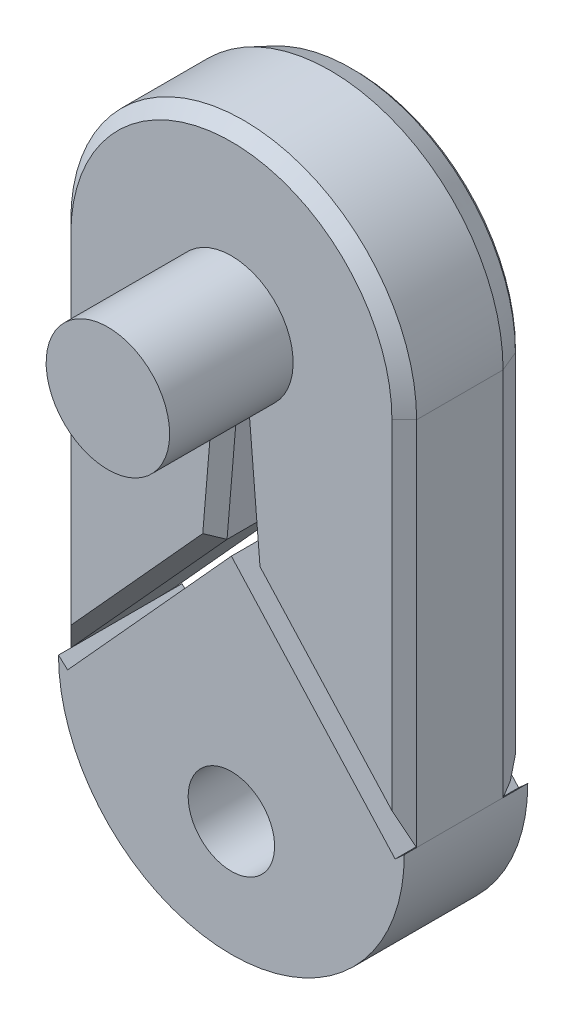
ISO-10303-21;
HEADER;
FILE_DESCRIPTION(('STEP AP214'),'2;1');
FILE_NAME('part.step','',(''),(''),'','','');
FILE_SCHEMA(('AUTOMOTIVE_DESIGN { 1 0 10303 214 1 1 1 1 }'));
ENDSEC;
DATA;
#1=APPLICATION_CONTEXT('core data for automotive mechanical design processes');
#2=APPLICATION_PROTOCOL_DEFINITION('international standard','automotive_design',2000,#1);
#3=PRODUCT_CONTEXT('',#1,'mechanical');
#4=PRODUCT('Part','Part','',(#3));
#5=PRODUCT_RELATED_PRODUCT_CATEGORY('part','',(#4));
#6=PRODUCT_DEFINITION_FORMATION('','',#4);
#7=PRODUCT_DEFINITION_CONTEXT('part definition',#1,'design');
#8=PRODUCT_DEFINITION('design','',#6,#7);
#9=PRODUCT_DEFINITION_SHAPE('','',#8);
#10=(LENGTH_UNIT() NAMED_UNIT(*) SI_UNIT(.MILLI.,.METRE.));
#11=(NAMED_UNIT(*) PLANE_ANGLE_UNIT() SI_UNIT($,.RADIAN.));
#12=(NAMED_UNIT(*) SI_UNIT($,.STERADIAN.) SOLID_ANGLE_UNIT());
#13=UNCERTAINTY_MEASURE_WITH_UNIT(LENGTH_MEASURE(1.E-05),#10,'distance_accuracy_value','');
#14=(GEOMETRIC_REPRESENTATION_CONTEXT(3) GLOBAL_UNCERTAINTY_ASSIGNED_CONTEXT((#13)) GLOBAL_UNIT_ASSIGNED_CONTEXT((#10,
#11,#12)) REPRESENTATION_CONTEXT('',''));
#15=CARTESIAN_POINT('',(0.,0.,0.));
#16=DIRECTION('',(0.,0.,1.));
#17=DIRECTION('',(1.,0.,0.));
#18=AXIS2_PLACEMENT_3D('',#15,#16,#17);
#19=CARTESIAN_POINT('',(0.,0.,10.));
#20=DIRECTION('',(0.,0.,1.));
#21=DIRECTION('',(1.,0.,0.));
#22=AXIS2_PLACEMENT_3D('',#19,#20,#21);
#23=PLANE('',#22);
#24=DIRECTION('',(0.,-1.,0.));
#25=VECTOR('',#24,1.);
#26=CARTESIAN_POINT('',(-13.,-30.,10.));
#27=LINE('',#26,#25);
#28=CARTESIAN_POINT('',(-13.,0.,10.));
#29=VERTEX_POINT('',#28);
#30=CARTESIAN_POINT('',(-13.,-27.4101408235993,10.));
#31=VERTEX_POINT('',#30);
#32=EDGE_CURVE('E243',#29,#31,#27,.T.);
#33=ORIENTED_EDGE('',*,*,#32,.T.);
#34=DIRECTION('',(0.672047401482572,0.740508129705895,0.));
#35=VECTOR('',#34,1.);
#36=CARTESIAN_POINT('',(-2.09093219648444,-15.3897783042367,10.));
#37=LINE('',#36,#35);
#38=CARTESIAN_POINT('',(-2.31853417543574,-15.6405658459767,10.));
#39=VERTEX_POINT('',#38);
#40=EDGE_CURVE('E314',#31,#39,#37,.T.);
#41=ORIENTED_EDGE('',*,*,#40,.T.);
#42=DIRECTION('',(0.0837810256564782,0.996484189407915,0.));
#43=VECTOR('',#42,1.);
#44=CARTESIAN_POINT('',(-1.41538931769032,-4.89863992138309,10.));
#45=LINE('',#44,#43);
#46=CARTESIAN_POINT('',(-1.40692571537873,-4.79797457594411,10.));
#47=VERTEX_POINT('',#46);
#48=EDGE_CURVE('E312',#39,#47,#45,.T.);
#49=ORIENTED_EDGE('',*,*,#48,.T.);
#50=CARTESIAN_POINT('',(0.,0.,10.));
#51=DIRECTION('',(0.,0.,1.));
#52=DIRECTION('',(1.,0.,0.));
#53=AXIS2_PLACEMENT_3D('',#50,#51,#52);
#54=CIRCLE('',#53,5.);
#55=CARTESIAN_POINT('',(1.40692571537873,-4.79797457594411,10.));
#56=VERTEX_POINT('',#55);
#57=EDGE_CURVE('E205',#56,#47,#54,.T.);
#58=ORIENTED_EDGE('',*,*,#57,.F.);
#59=DIRECTION('',(0.0837810256564782,-0.996484189407915,0.));
#60=VECTOR('',#59,1.);
#61=CARTESIAN_POINT('',(2.34690825618647,-15.9780446800628,10.));
#62=LINE('',#61,#60);
#63=CARTESIAN_POINT('',(2.31853417543574,-15.6405658459767,10.));
#64=VERTEX_POINT('',#63);
#65=EDGE_CURVE('E308',#56,#64,#62,.T.);
#66=ORIENTED_EDGE('',*,*,#65,.T.);
#67=DIRECTION('',(0.67204740148257,-0.740508129705897,0.));
#68=VECTOR('',#67,1.);
#69=CARTESIAN_POINT('',(13.7405081297059,-28.2260837004721,10.));
#70=LINE('',#69,#68);
#71=CARTESIAN_POINT('',(13.,-27.4101408235993,10.));
#72=VERTEX_POINT('',#71);
#73=EDGE_CURVE('E310',#64,#72,#70,.T.);
#74=ORIENTED_EDGE('',*,*,#73,.T.);
#75=DIRECTION('',(0.,1.,0.));
#76=VECTOR('',#75,1.);
#77=CARTESIAN_POINT('',(13.,0.,10.));
#78=LINE('',#77,#76);
#79=CARTESIAN_POINT('',(13.,0.,10.));
#80=VERTEX_POINT('',#79);
#81=EDGE_CURVE('E235',#72,#80,#78,.T.);
#82=ORIENTED_EDGE('',*,*,#81,.T.);
#83=CARTESIAN_POINT('',(0.,0.,10.));
#84=DIRECTION('',(0.,0.,1.));
#85=DIRECTION('',(1.,0.,0.));
#86=AXIS2_PLACEMENT_3D('',#83,#84,#85);
#87=CIRCLE('',#86,13.);
#88=EDGE_CURVE('E241',#80,#29,#87,.T.);
#89=ORIENTED_EDGE('',*,*,#88,.T.);
#90=EDGE_LOOP('',(#33,#41,#49,#58,#66,#74,#82,#89));
#91=FACE_BOUND('',#90,.T.);
#92=ADVANCED_FACE('F48',(#91),#23,.T.);
#93=CARTESIAN_POINT('',(0.,0.,10.));
#94=DIRECTION('',(0.,0.,-1.));
#95=DIRECTION('',(-1.,0.,0.));
#96=AXIS2_PLACEMENT_3D('',#93,#94,#95);
#97=CYLINDRICAL_SURFACE('',#96,14.);
#98=DIRECTION('',(0.,0.,-1.));
#99=VECTOR('',#98,1.);
#100=CARTESIAN_POINT('',(14.,0.,10.));
#101=LINE('',#100,#99);
#102=CARTESIAN_POINT('',(14.,0.,9.00000000000001));
#103=VERTEX_POINT('',#102);
#104=CARTESIAN_POINT('',(14.,0.,2.00000000000002));
#105=VERTEX_POINT('',#104);
#106=EDGE_CURVE('E220',#103,#105,#101,.T.);
#107=ORIENTED_EDGE('',*,*,#106,.T.);
#108=CARTESIAN_POINT('',(0.,0.,2.00000000000002));
#109=DIRECTION('',(0.,0.,-1.));
#110=DIRECTION('',(-1.,0.,0.));
#111=AXIS2_PLACEMENT_3D('',#108,#109,#110);
#112=CIRCLE('',#111,14.);
#113=CARTESIAN_POINT('',(-14.,0.,2.00000000000002));
#114=VERTEX_POINT('',#113);
#115=EDGE_CURVE('E58',#105,#114,#112,.F.);
#116=ORIENTED_EDGE('',*,*,#115,.T.);
#117=DIRECTION('',(0.,0.,-1.));
#118=VECTOR('',#117,1.);
#119=CARTESIAN_POINT('',(-14.,0.,10.));
#120=LINE('',#119,#118);
#121=CARTESIAN_POINT('',(-14.,0.,9.00000000000001));
#122=VERTEX_POINT('',#121);
#123=EDGE_CURVE('E214',#122,#114,#120,.T.);
#124=ORIENTED_EDGE('',*,*,#123,.F.);
#125=CARTESIAN_POINT('',(0.,0.,9.00000000000001));
#126=DIRECTION('',(0.,0.,1.));
#127=DIRECTION('',(1.,0.,0.));
#128=AXIS2_PLACEMENT_3D('',#125,#126,#127);
#129=CIRCLE('',#128,14.);
#130=EDGE_CURVE('E248',#122,#103,#129,.F.);
#131=ORIENTED_EDGE('',*,*,#130,.T.);
#132=EDGE_LOOP('',(#107,#116,#124,#131));
#133=FACE_BOUND('',#132,.T.);
#134=ADVANCED_FACE('F388',(#133),#97,.T.);
#135=CARTESIAN_POINT('',(-14.,0.,10.));
#136=DIRECTION('',(1.,0.,0.));
#137=DIRECTION('',(0.,1.,0.));
#138=AXIS2_PLACEMENT_3D('',#135,#136,#137);
#139=PLANE('',#138);
#140=ORIENTED_EDGE('',*,*,#123,.T.);
#141=DIRECTION('',(0.,-1.,0.));
#142=VECTOR('',#141,1.);
#143=CARTESIAN_POINT('',(-14.,-30.,2.00000000000002));
#144=LINE('',#143,#142);
#145=CARTESIAN_POINT('',(-14.,-30.,2.00000000000002));
#146=VERTEX_POINT('',#145);
#147=EDGE_CURVE('E341',#114,#146,#144,.T.);
#148=ORIENTED_EDGE('',*,*,#147,.T.);
#149=DIRECTION('',(0.,0.,-1.));
#150=VECTOR('',#149,1.);
#151=CARTESIAN_POINT('',(-14.,-30.,10.));
#152=LINE('',#151,#150);
#153=CARTESIAN_POINT('',(-14.,-30.,9.00000000000001));
#154=VERTEX_POINT('',#153);
#155=EDGE_CURVE('E233',#154,#146,#152,.T.);
#156=ORIENTED_EDGE('',*,*,#155,.F.);
#157=DIRECTION('',(0.,1.,0.));
#158=VECTOR('',#157,1.);
#159=CARTESIAN_POINT('',(-14.,0.,9.00000000000001));
#160=LINE('',#159,#158);
#161=EDGE_CURVE('E246',#154,#122,#160,.T.);
#162=ORIENTED_EDGE('',*,*,#161,.T.);
#163=EDGE_LOOP('',(#140,#148,#156,#162));
#164=FACE_BOUND('',#163,.T.);
#165=ADVANCED_FACE('F363',(#164),#139,.F.);
#166=CARTESIAN_POINT('',(14.,0.,10.));
#167=DIRECTION('',(-1.,0.,0.));
#168=DIRECTION('',(0.,-1.,0.));
#169=AXIS2_PLACEMENT_3D('',#166,#167,#168);
#170=PLANE('',#169);
#171=DIRECTION('',(0.,0.,-1.));
#172=VECTOR('',#171,1.);
#173=CARTESIAN_POINT('',(14.,-30.,10.));
#174=LINE('',#173,#172);
#175=CARTESIAN_POINT('',(14.,-30.,9.00000000000001));
#176=VERTEX_POINT('',#175);
#177=CARTESIAN_POINT('',(14.,-30.,2.00000000000002));
#178=VERTEX_POINT('',#177);
#179=EDGE_CURVE('E211',#176,#178,#174,.T.);
#180=ORIENTED_EDGE('',*,*,#179,.T.);
#181=DIRECTION('',(0.,1.,0.));
#182=VECTOR('',#181,1.);
#183=CARTESIAN_POINT('',(14.,0.,2.00000000000002));
#184=LINE('',#183,#182);
#185=EDGE_CURVE('E328',#178,#105,#184,.T.);
#186=ORIENTED_EDGE('',*,*,#185,.T.);
#187=ORIENTED_EDGE('',*,*,#106,.F.);
#188=DIRECTION('',(0.,-1.,0.));
#189=VECTOR('',#188,1.);
#190=CARTESIAN_POINT('',(14.,-30.0000000000001,9.00000000000001));
#191=LINE('',#190,#189);
#192=EDGE_CURVE('E250',#103,#176,#191,.T.);
#193=ORIENTED_EDGE('',*,*,#192,.T.);
#194=EDGE_LOOP('',(#180,#186,#187,#193));
#195=FACE_BOUND('',#194,.T.);
#196=ADVANCED_FACE('F391',(#195),#170,.F.);
#197=CARTESIAN_POINT('',(0.,0.,0.));
#198=DIRECTION('',(0.,0.,1.));
#199=DIRECTION('',(1.,0.,0.));
#200=AXIS2_PLACEMENT_3D('',#197,#198,#199);
#201=PLANE('',#200);
#202=DIRECTION('',(-0.0837810256564782,-0.996484189407915,0.));
#203=VECTOR('',#202,1.);
#204=CARTESIAN_POINT('',(-0.996484189407919,0.0837810256564786,0.));
#205=LINE('',#204,#203);
#206=CARTESIAN_POINT('',(0.,11.9358767950662,0.));
#207=VERTEX_POINT('',#206);
#208=CARTESIAN_POINT('',(-2.31853417543573,-15.6405658459767,0.));
#209=VERTEX_POINT('',#208);
#210=EDGE_CURVE('E274',#207,#209,#205,.T.);
#211=ORIENTED_EDGE('',*,*,#210,.T.);
#212=DIRECTION('',(-0.672047401482572,-0.740508129705895,0.));
#213=VECTOR('',#212,1.);
#214=CARTESIAN_POINT('',(6.51225673841377,-5.91019199286382,0.));
#215=LINE('',#214,#213);
#216=CARTESIAN_POINT('',(-13.,-27.4101408235993,0.));
#217=VERTEX_POINT('',#216);
#218=EDGE_CURVE('E280',#209,#217,#215,.T.);
#219=ORIENTED_EDGE('',*,*,#218,.T.);
#220=DIRECTION('',(0.,1.,0.));
#221=VECTOR('',#220,1.);
#222=CARTESIAN_POINT('',(-13.,0.,0.));
#223=LINE('',#222,#221);
#224=CARTESIAN_POINT('',(-13.,0.,0.));
#225=VERTEX_POINT('',#224);
#226=EDGE_CURVE('E265',#217,#225,#223,.T.);
#227=ORIENTED_EDGE('',*,*,#226,.T.);
#228=CARTESIAN_POINT('',(0.,0.,0.));
#229=DIRECTION('',(0.,0.,1.));
#230=DIRECTION('',(1.,0.,0.));
#231=AXIS2_PLACEMENT_3D('',#228,#229,#230);
#232=CIRCLE('',#231,13.);
#233=CARTESIAN_POINT('',(13.,0.,0.));
#234=VERTEX_POINT('',#233);
#235=EDGE_CURVE('E262',#225,#234,#232,.F.);
#236=ORIENTED_EDGE('',*,*,#235,.T.);
#237=DIRECTION('',(0.,-1.,0.));
#238=VECTOR('',#237,1.);
#239=CARTESIAN_POINT('',(13.,0.,0.));
#240=LINE('',#239,#238);
#241=CARTESIAN_POINT('',(13.,-27.4101408235994,0.));
#242=VERTEX_POINT('',#241);
#243=EDGE_CURVE('E253',#234,#242,#240,.T.);
#244=ORIENTED_EDGE('',*,*,#243,.T.);
#245=DIRECTION('',(-0.67204740148257,0.740508129705897,0.));
#246=VECTOR('',#245,1.);
#247=CARTESIAN_POINT('',(-6.51225673841376,-5.91019199286378,0.));
#248=LINE('',#247,#246);
#249=CARTESIAN_POINT('',(2.31853417543573,-15.6405658459768,0.));
#250=VERTEX_POINT('',#249);
#251=EDGE_CURVE('E278',#242,#250,#248,.T.);
#252=ORIENTED_EDGE('',*,*,#251,.T.);
#253=DIRECTION('',(-0.0837810256564782,0.996484189407915,0.));
#254=VECTOR('',#253,1.);
#255=CARTESIAN_POINT('',(0.996484189407919,0.0837810256564786,0.));
#256=LINE('',#255,#254);
#257=EDGE_CURVE('E276',#250,#207,#256,.T.);
#258=ORIENTED_EDGE('',*,*,#257,.T.);
#259=EDGE_LOOP('',(#211,#219,#227,#236,#244,#252,#258));
#260=FACE_BOUND('',#259,.T.);
#261=ADVANCED_FACE('F418',(#260),#201,.F.);
#262=CARTESIAN_POINT('',(0.,0.,20.));
#263=DIRECTION('',(0.,0.,-1.));
#264=DIRECTION('',(-1.,0.,0.));
#265=AXIS2_PLACEMENT_3D('',#262,#263,#264);
#266=CYLINDRICAL_SURFACE('',#265,5.);
#267=CARTESIAN_POINT('',(0.,0.,20.));
#268=DIRECTION('',(0.,0.,1.));
#269=DIRECTION('',(1.,0.,0.));
#270=AXIS2_PLACEMENT_3D('',#267,#268,#269);
#271=CIRCLE('',#270,5.);
#272=CARTESIAN_POINT('',(5.,0.,20.));
#273=VERTEX_POINT('',#272);
#274=EDGE_CURVE('E226',#273,#273,#271,.T.);
#275=ORIENTED_EDGE('',*,*,#274,.F.);
#276=EDGE_LOOP('',(#275));
#277=FACE_BOUND('',#276,.T.);
#278=CARTESIAN_POINT('',(0.,0.,15.));
#279=DIRECTION('',(0.,0.,1.));
#280=DIRECTION('',(1.,0.,0.));
#281=AXIS2_PLACEMENT_3D('',#278,#279,#280);
#282=CIRCLE('',#281,5.);
#283=CARTESIAN_POINT('',(-0.418905128282391,-4.98242094703957,15.));
#284=VERTEX_POINT('',#283);
#285=CARTESIAN_POINT('',(0.418905128282391,-4.98242094703957,15.));
#286=VERTEX_POINT('',#285);
#287=EDGE_CURVE('E189',#284,#286,#282,.T.);
#288=ORIENTED_EDGE('',*,*,#287,.T.);
#289=DIRECTION('',(0.,0.,-1.));
#290=VECTOR('',#289,1.);
#291=CARTESIAN_POINT('',(0.418905128282391,-4.98242094703957,20.));
#292=LINE('',#291,#290);
#293=CARTESIAN_POINT('',(0.418905128282391,-4.98242094703957,8.99999999999999));
#294=VERTEX_POINT('',#293);
#295=EDGE_CURVE('E198',#286,#294,#292,.T.);
#296=ORIENTED_EDGE('',*,*,#295,.T.);
#297=CARTESIAN_POINT('',(0.,0.,8.99999999999999));
#298=DIRECTION('',(-0.704620727675515,-0.0592421313764597,0.707106781186549));
#299=DIRECTION('',(-0.704620727675518,-0.05924213137646,-0.707106781186546));
#300=AXIS2_PLACEMENT_3D('',#297,#298,#299);
#301=ELLIPSE('',#300,7.07106781186546,5.);
#302=EDGE_CURVE('E326',#294,#56,#301,.T.);
#303=ORIENTED_EDGE('',*,*,#302,.T.);
#304=ORIENTED_EDGE('',*,*,#57,.T.);
#305=CARTESIAN_POINT('',(0.,0.,8.99999999999999));
#306=DIRECTION('',(0.704620727675515,-0.0592421313764597,0.707106781186549));
#307=DIRECTION('',(0.704620727675518,-0.05924213137646,-0.707106781186546));
#308=AXIS2_PLACEMENT_3D('',#305,#306,#307);
#309=ELLIPSE('',#308,7.07106781186546,5.);
#310=CARTESIAN_POINT('',(-0.418905128282391,-4.98242094703957,8.99999999999999));
#311=VERTEX_POINT('',#310);
#312=EDGE_CURVE('E324',#47,#311,#309,.T.);
#313=ORIENTED_EDGE('',*,*,#312,.T.);
#314=DIRECTION('',(0.,0.,-1.));
#315=VECTOR('',#314,1.);
#316=CARTESIAN_POINT('',(-0.418905128282391,-4.98242094703957,20.));
#317=LINE('',#316,#315);
#318=EDGE_CURVE('E210',#311,#284,#317,.F.);
#319=ORIENTED_EDGE('',*,*,#318,.T.);
#320=EDGE_LOOP('',(#288,#296,#303,#304,#313,#319));
#321=FACE_BOUND('',#320,.T.);
#322=ADVANCED_FACE('F208',(#277,#321),#266,.T.);
#323=CARTESIAN_POINT('',(0.,0.,20.));
#324=DIRECTION('',(0.,0.,1.));
#325=DIRECTION('',(1.,0.,0.));
#326=AXIS2_PLACEMENT_3D('',#323,#324,#325);
#327=PLANE('',#326);
#328=ORIENTED_EDGE('',*,*,#274,.T.);
#329=EDGE_LOOP('',(#328));
#330=FACE_BOUND('',#329,.T.);
#331=ADVANCED_FACE('F677',(#330),#327,.T.);
#332=CARTESIAN_POINT('',(0.,0.,15.));
#333=DIRECTION('',(0.,0.,1.));
#334=DIRECTION('',(1.,0.,0.));
#335=AXIS2_PLACEMENT_3D('',#332,#333,#334);
#336=PLANE('',#335);
#337=DIRECTION('',(0.0837810256564782,0.996484189407915,0.));
#338=VECTOR('',#337,1.);
#339=CARTESIAN_POINT('',(0.,0.,15.));
#340=LINE('',#339,#338);
#341=CARTESIAN_POINT('',(0.,0.,15.));
#342=VERTEX_POINT('',#341);
#343=EDGE_CURVE('E191',#284,#342,#340,.T.);
#344=ORIENTED_EDGE('',*,*,#343,.T.);
#345=DIRECTION('',(0.0837810256564782,-0.996484189407915,0.));
#346=VECTOR('',#345,1.);
#347=CARTESIAN_POINT('',(1.35042406677854,-16.0618257057193,15.));
#348=LINE('',#347,#346);
#349=EDGE_CURVE('E185',#342,#286,#348,.T.);
#350=ORIENTED_EDGE('',*,*,#349,.T.);
#351=ORIENTED_EDGE('',*,*,#287,.F.);
#352=EDGE_LOOP('',(#344,#350,#351));
#353=FACE_BOUND('',#352,.T.);
#354=ADVANCED_FACE('F187',(#353),#336,.F.);
#355=CARTESIAN_POINT('',(0.,0.,15.));
#356=DIRECTION('',(-0.996484189407915,0.0837810256564782,0.));
#357=DIRECTION('',(-0.0837810256564782,-0.996484189407915,0.));
#358=AXIS2_PLACEMENT_3D('',#355,#356,#357);
#359=PLANE('',#358);
#360=ORIENTED_EDGE('',*,*,#318,.F.);
#361=DIRECTION('',(-0.0837810256564782,-0.996484189407915,0.));
#362=VECTOR('',#361,1.);
#363=CARTESIAN_POINT('',(-1.35042406677854,-16.0618257057193,8.99999999999999));
#364=LINE('',#363,#362);
#365=CARTESIAN_POINT('',(-1.35042406677854,-16.0618257057193,8.99999999999999));
#366=VERTEX_POINT('',#365);
#367=EDGE_CURVE('E316',#311,#366,#364,.T.);
#368=ORIENTED_EDGE('',*,*,#367,.T.);
#369=DIRECTION('',(0.,0.,-1.));
#370=VECTOR('',#369,1.);
#371=CARTESIAN_POINT('',(-1.35042406677854,-16.0618257057193,15.));
#372=LINE('',#371,#370);
#373=CARTESIAN_POINT('',(-1.35042406677854,-16.0618257057193,1.));
#374=VERTEX_POINT('',#373);
#375=EDGE_CURVE('E195',#366,#374,#372,.T.);
#376=ORIENTED_EDGE('',*,*,#375,.T.);
#377=DIRECTION('',(0.0837810256564782,0.996484189407915,0.));
#378=VECTOR('',#377,1.);
#379=CARTESIAN_POINT('',(0.,0.,1.));
#380=LINE('',#379,#378);
#381=CARTESIAN_POINT('',(0.,0.,1.));
#382=VERTEX_POINT('',#381);
#383=EDGE_CURVE('E292',#374,#382,#380,.T.);
#384=ORIENTED_EDGE('',*,*,#383,.T.);
#385=DIRECTION('',(0.,0.,-1.));
#386=VECTOR('',#385,1.);
#387=CARTESIAN_POINT('',(0.,0.,15.));
#388=LINE('',#387,#386);
#389=EDGE_CURVE('E231',#342,#382,#388,.T.);
#390=ORIENTED_EDGE('',*,*,#389,.F.);
#391=ORIENTED_EDGE('',*,*,#343,.F.);
#392=EDGE_LOOP('',(#360,#368,#376,#384,#390,#391));
#393=FACE_BOUND('',#392,.T.);
#394=ADVANCED_FACE('F436',(#393),#359,.F.);
#395=CARTESIAN_POINT('',(1.35042406677854,-16.0618257057193,15.));
#396=DIRECTION('',(0.996484189407915,0.0837810256564782,0.));
#397=DIRECTION('',(-0.0837810256564782,0.996484189407915,0.));
#398=AXIS2_PLACEMENT_3D('',#395,#396,#397);
#399=PLANE('',#398);
#400=DIRECTION('',(0.,0.,-1.));
#401=VECTOR('',#400,1.);
#402=CARTESIAN_POINT('',(1.35042406677854,-16.0618257057193,15.));
#403=LINE('',#402,#401);
#404=CARTESIAN_POINT('',(1.35042406677854,-16.0618257057193,8.99999999999999));
#405=VERTEX_POINT('',#404);
#406=CARTESIAN_POINT('',(1.35042406677854,-16.0618257057193,1.));
#407=VERTEX_POINT('',#406);
#408=EDGE_CURVE('E234',#405,#407,#403,.T.);
#409=ORIENTED_EDGE('',*,*,#408,.F.);
#410=DIRECTION('',(-0.0837810256564782,0.996484189407915,0.));
#411=VECTOR('',#410,1.);
#412=CARTESIAN_POINT('',(0.418905128282391,-4.98242094703957,8.99999999999999));
#413=LINE('',#412,#411);
#414=EDGE_CURVE('E202',#405,#294,#413,.T.);
#415=ORIENTED_EDGE('',*,*,#414,.T.);
#416=ORIENTED_EDGE('',*,*,#295,.F.);
#417=ORIENTED_EDGE('',*,*,#349,.F.);
#418=ORIENTED_EDGE('',*,*,#389,.T.);
#419=DIRECTION('',(0.0837810256564782,-0.996484189407915,0.));
#420=VECTOR('',#419,1.);
#421=CARTESIAN_POINT('',(1.35042406677854,-16.0618257057193,1.));
#422=LINE('',#421,#420);
#423=EDGE_CURVE('E289',#382,#407,#422,.T.);
#424=ORIENTED_EDGE('',*,*,#423,.T.);
#425=EDGE_LOOP('',(#409,#415,#416,#417,#418,#424));
#426=FACE_BOUND('',#425,.T.);
#427=ADVANCED_FACE('F200',(#426),#399,.F.);
#428=CARTESIAN_POINT('',(-1.35042406677854,-16.0618257057193,15.));
#429=DIRECTION('',(-0.740508129705895,0.672047401482572,0.));
#430=DIRECTION('',(-0.672047401482572,-0.740508129705895,0.));
#431=AXIS2_PLACEMENT_3D('',#428,#429,#430);
#432=PLANE('',#431);
#433=ORIENTED_EDGE('',*,*,#155,.T.);
#434=DIRECTION('',(-0.352617064778545,-0.388537776599549,0.851292900112554));
#435=VECTOR('',#434,1.);
#436=CARTESIAN_POINT('',(-9.88984848979655,-25.4711518846524,-7.92278351934138));
#437=LINE('',#436,#435);
#438=CARTESIAN_POINT('',(-13.5857864376269,-29.5435909584725,1.));
#439=VERTEX_POINT('',#438);
#440=EDGE_CURVE('E343',#146,#439,#437,.F.);
#441=ORIENTED_EDGE('',*,*,#440,.T.);
#442=DIRECTION('',(0.672047401482572,0.740508129705895,0.));
#443=VECTOR('',#442,1.);
#444=CARTESIAN_POINT('',(-1.35042406677854,-16.0618257057193,1.));
#445=LINE('',#444,#443);
#446=EDGE_CURVE('E268',#439,#374,#445,.T.);
#447=ORIENTED_EDGE('',*,*,#446,.T.);
#448=ORIENTED_EDGE('',*,*,#375,.F.);
#449=DIRECTION('',(-0.672047401482572,-0.740508129705895,0.));
#450=VECTOR('',#449,1.);
#451=CARTESIAN_POINT('',(-13.,-28.8981311019546,8.99999999999999));
#452=LINE('',#451,#450);
#453=EDGE_CURVE('E294',#366,#154,#452,.T.);
#454=ORIENTED_EDGE('',*,*,#453,.T.);
#455=EDGE_LOOP('',(#433,#441,#447,#448,#454));
#456=FACE_BOUND('',#455,.T.);
#457=ADVANCED_FACE('F367',(#456),#432,.F.);
#458=CARTESIAN_POINT('',(14.,-30.0000000000001,15.));
#459=DIRECTION('',(0.740508129705897,0.67204740148257,0.));
#460=DIRECTION('',(-0.67204740148257,0.740508129705897,0.));
#461=AXIS2_PLACEMENT_3D('',#458,#459,#460);
#462=PLANE('',#461);
#463=DIRECTION('',(0.67204740148257,-0.740508129705897,0.));
#464=VECTOR('',#463,1.);
#465=CARTESIAN_POINT('',(14.,-30.0000000000001,1.));
#466=LINE('',#465,#464);
#467=CARTESIAN_POINT('',(13.5857864376269,-29.5435909584726,1.));
#468=VERTEX_POINT('',#467);
#469=EDGE_CURVE('E284',#407,#468,#466,.T.);
#470=ORIENTED_EDGE('',*,*,#469,.T.);
#471=DIRECTION('',(-0.352617064778545,0.388537776599551,-0.851292900112553));
#472=VECTOR('',#471,1.);
#473=CARTESIAN_POINT('',(9.88984848979653,-25.4711518846524,-7.92278351934146));
#474=LINE('',#473,#472);
#475=EDGE_CURVE('E339',#468,#178,#474,.F.);
#476=ORIENTED_EDGE('',*,*,#475,.T.);
#477=ORIENTED_EDGE('',*,*,#179,.F.);
#478=DIRECTION('',(-0.67204740148257,0.740508129705897,0.));
#479=VECTOR('',#478,1.);
#480=CARTESIAN_POINT('',(1.35042406677854,-16.0618257057193,8.99999999999999));
#481=LINE('',#480,#479);
#482=EDGE_CURVE('E318',#176,#405,#481,.T.);
#483=ORIENTED_EDGE('',*,*,#482,.T.);
#484=ORIENTED_EDGE('',*,*,#408,.T.);
#485=EDGE_LOOP('',(#470,#476,#477,#483,#484));
#486=FACE_BOUND('',#485,.T.);
#487=ADVANCED_FACE('F402',(#486),#462,.F.);
#488=CARTESIAN_POINT('',(13.,0.,10.));
#489=DIRECTION('',(0.707106781186547,0.,0.707106781186547));
#490=DIRECTION('',(0.,-1.,0.));
#491=AXIS2_PLACEMENT_3D('',#488,#489,#490);
#492=PLANE('',#491);
#493=ORIENTED_EDGE('',*,*,#81,.F.);
#494=DIRECTION('',(0.338888230829785,-0.877672794388727,-0.338888230829785));
#495=VECTOR('',#494,1.);
#496=CARTESIAN_POINT('',(4.84732011787523,-6.29584801862084,18.1526798821248));
#497=LINE('',#496,#495);
#498=EDGE_CURVE('E321',#72,#176,#497,.T.);
#499=ORIENTED_EDGE('',*,*,#498,.T.);
#500=ORIENTED_EDGE('',*,*,#192,.F.);
#501=DIRECTION('',(0.707106781186547,0.,-0.707106781186547));
#502=VECTOR('',#501,1.);
#503=CARTESIAN_POINT('',(13.,0.,10.));
#504=LINE('',#503,#502);
#505=EDGE_CURVE('E223',#80,#103,#504,.T.);
#506=ORIENTED_EDGE('',*,*,#505,.F.);
#507=EDGE_LOOP('',(#493,#499,#500,#506));
#508=FACE_BOUND('',#507,.T.);
#509=ADVANCED_FACE('F394',(#508),#492,.T.);
#510=CARTESIAN_POINT('',(0.,0.,10.));
#511=DIRECTION('',(0.,0.,-1.));
#512=DIRECTION('',(-1.,0.,0.));
#513=AXIS2_PLACEMENT_3D('',#510,#511,#512);
#514=CONICAL_SURFACE('',#513,13.,0.785398163397448);
#515=ORIENTED_EDGE('',*,*,#505,.T.);
#516=ORIENTED_EDGE('',*,*,#130,.F.);
#517=DIRECTION('',(-0.707106781186547,0.,-0.707106781186547));
#518=VECTOR('',#517,1.);
#519=CARTESIAN_POINT('',(-13.,0.,10.));
#520=LINE('',#519,#518);
#521=EDGE_CURVE('E254',#29,#122,#520,.T.);
#522=ORIENTED_EDGE('',*,*,#521,.F.);
#523=ORIENTED_EDGE('',*,*,#88,.F.);
#524=EDGE_LOOP('',(#515,#516,#522,#523));
#525=FACE_BOUND('',#524,.T.);
#526=ADVANCED_FACE('F385',(#525),#514,.T.);
#527=CARTESIAN_POINT('',(-13.,0.,10.));
#528=DIRECTION('',(-0.707106781186547,0.,0.707106781186547));
#529=DIRECTION('',(0.,1.,0.));
#530=AXIS2_PLACEMENT_3D('',#527,#528,#529);
#531=PLANE('',#530);
#532=ORIENTED_EDGE('',*,*,#161,.F.);
#533=DIRECTION('',(0.338888230829786,0.877672794388726,0.338888230829786));
#534=VECTOR('',#533,1.);
#535=CARTESIAN_POINT('',(-4.84732011787523,-6.29584801862087,18.1526798821248));
#536=LINE('',#535,#534);
#537=EDGE_CURVE('E306',#154,#31,#536,.T.);
#538=ORIENTED_EDGE('',*,*,#537,.T.);
#539=ORIENTED_EDGE('',*,*,#32,.F.);
#540=ORIENTED_EDGE('',*,*,#521,.T.);
#541=EDGE_LOOP('',(#532,#538,#539,#540));
#542=FACE_BOUND('',#541,.T.);
#543=ADVANCED_FACE('F376',(#542),#531,.T.);
#544=CARTESIAN_POINT('',(14.,0.,1.));
#545=DIRECTION('',(-0.707106781186545,0.,0.70710678118655));
#546=DIRECTION('',(0.,1.,0.));
#547=AXIS2_PLACEMENT_3D('',#544,#545,#546);
#548=PLANE('',#547);
#549=DIRECTION('',(-0.70710678118655,0.,-0.707106781186545));
#550=VECTOR('',#549,1.);
#551=CARTESIAN_POINT('',(14.,0.,1.));
#552=LINE('',#551,#550);
#553=CARTESIAN_POINT('',(13.2928932188134,0.,0.292893218813447));
#554=VERTEX_POINT('',#553);
#555=EDGE_CURVE('E257',#554,#234,#552,.T.);
#556=ORIENTED_EDGE('',*,*,#555,.F.);
#557=DIRECTION('',(0.,1.,0.));
#558=VECTOR('',#557,1.);
#559=CARTESIAN_POINT('',(13.2928932188134,-30.,0.292893218813447));
#560=LINE('',#559,#558);
#561=CARTESIAN_POINT('',(13.2928932188134,-28.1686930140489,0.292893218813447));
#562=VERTEX_POINT('',#561);
#563=EDGE_CURVE('E335',#554,#562,#560,.F.);
#564=ORIENTED_EDGE('',*,*,#563,.T.);
#565=DIRECTION('',(-0.338888230829787,0.877672794388727,-0.338888230829784));
#566=VECTOR('',#565,1.);
#567=CARTESIAN_POINT('',(5.07701058386506,-6.89071397969653,-7.92298941613488));
#568=LINE('',#567,#566);
#569=EDGE_CURVE('E287',#562,#242,#568,.T.);
#570=ORIENTED_EDGE('',*,*,#569,.T.);
#571=ORIENTED_EDGE('',*,*,#243,.F.);
#572=EDGE_LOOP('',(#556,#564,#570,#571));
#573=FACE_BOUND('',#572,.T.);
#574=ADVANCED_FACE('F424',(#573),#548,.F.);
#575=CARTESIAN_POINT('',(0.,0.,1.));
#576=DIRECTION('',(0.,0.,1.));
#577=DIRECTION('',(1.,0.,0.));
#578=AXIS2_PLACEMENT_3D('',#575,#576,#577);
#579=CONICAL_SURFACE('',#578,14.,0.785398163397452);
#580=DIRECTION('',(0.70710678118655,0.,-0.707106781186545));
#581=VECTOR('',#580,1.);
#582=CARTESIAN_POINT('',(-14.,0.,1.));
#583=LINE('',#582,#581);
#584=CARTESIAN_POINT('',(-13.2928932188134,0.,0.292893218813447));
#585=VERTEX_POINT('',#584);
#586=EDGE_CURVE('E269',#585,#225,#583,.T.);
#587=ORIENTED_EDGE('',*,*,#586,.F.);
#588=CARTESIAN_POINT('',(0.,0.,0.292893218813447));
#589=DIRECTION('',(0.,0.,1.));
#590=DIRECTION('',(1.,0.,0.));
#591=AXIS2_PLACEMENT_3D('',#588,#589,#590);
#592=CIRCLE('',#591,13.2928932188134);
#593=EDGE_CURVE('E12',#585,#554,#592,.F.);
#594=ORIENTED_EDGE('',*,*,#593,.T.);
#595=ORIENTED_EDGE('',*,*,#555,.T.);
#596=ORIENTED_EDGE('',*,*,#235,.F.);
#597=EDGE_LOOP('',(#587,#594,#595,#596));
#598=FACE_BOUND('',#597,.T.);
#599=ADVANCED_FACE('F427',(#598),#579,.T.);
#600=CARTESIAN_POINT('',(-14.,0.,1.));
#601=DIRECTION('',(0.707106781186545,0.,0.70710678118655));
#602=DIRECTION('',(0.,-1.,0.));
#603=AXIS2_PLACEMENT_3D('',#600,#601,#602);
#604=PLANE('',#603);
#605=DIRECTION('',(-0.338888230829787,-0.877672794388726,0.338888230829785));
#606=VECTOR('',#605,1.);
#607=CARTESIAN_POINT('',(-5.07701058386507,-6.89071397969655,-7.92298941613487));
#608=LINE('',#607,#606);
#609=CARTESIAN_POINT('',(-13.2928932188134,-28.1686930140488,0.292893218813447));
#610=VERTEX_POINT('',#609);
#611=EDGE_CURVE('E282',#217,#610,#608,.T.);
#612=ORIENTED_EDGE('',*,*,#611,.T.);
#613=DIRECTION('',(0.,-1.,0.));
#614=VECTOR('',#613,1.);
#615=CARTESIAN_POINT('',(-13.2928932188134,0.,0.292893218813447));
#616=LINE('',#615,#614);
#617=EDGE_CURVE('E66',#610,#585,#616,.F.);
#618=ORIENTED_EDGE('',*,*,#617,.T.);
#619=ORIENTED_EDGE('',*,*,#586,.T.);
#620=ORIENTED_EDGE('',*,*,#226,.F.);
#621=EDGE_LOOP('',(#612,#618,#619,#620));
#622=FACE_BOUND('',#621,.T.);
#623=ADVANCED_FACE('F429',(#622),#604,.F.);
#624=CARTESIAN_POINT('',(14.,-30.0000000000001,1.));
#625=DIRECTION('',(0.523618320038807,0.475209274867123,0.707106781186547));
#626=DIRECTION('',(0.67204740148257,-0.740508129705897,0.));
#627=AXIS2_PLACEMENT_3D('',#624,#625,#626);
#628=PLANE('',#627);
#629=ORIENTED_EDGE('',*,*,#569,.F.);
#630=DIRECTION('',(0.186132635257687,-0.873742924614941,0.449363932439352));
#631=VECTOR('',#630,1.);
#632=CARTESIAN_POINT('',(13.6743637633492,-29.9593902164802,1.21384458107748));
#633=LINE('',#632,#631);
#634=EDGE_CURVE('E337',#562,#468,#633,.T.);
#635=ORIENTED_EDGE('',*,*,#634,.T.);
#636=ORIENTED_EDGE('',*,*,#469,.F.);
#637=DIRECTION('',(-0.665733904050468,-0.289684994029399,0.687663415656169));
#638=VECTOR('',#637,1.);
#639=CARTESIAN_POINT('',(1.35042406677854,-16.0618257057193,1.));
#640=LINE('',#639,#638);
#641=EDGE_CURVE('E271',#250,#407,#640,.T.);
#642=ORIENTED_EDGE('',*,*,#641,.F.);
#643=ORIENTED_EDGE('',*,*,#251,.F.);
#644=EDGE_LOOP('',(#629,#635,#636,#642,#643));
#645=FACE_BOUND('',#644,.T.);
#646=ADVANCED_FACE('F410',(#645),#628,.F.);
#647=CARTESIAN_POINT('',(1.35042406677854,-16.0618257057193,1.));
#648=DIRECTION('',(0.704620727675515,0.0592421313764598,0.707106781186549));
#649=DIRECTION('',(0.0837810256564782,-0.996484189407915,0.));
#650=AXIS2_PLACEMENT_3D('',#647,#648,#649);
#651=PLANE('',#650);
#652=ORIENTED_EDGE('',*,*,#641,.T.);
#653=ORIENTED_EDGE('',*,*,#423,.F.);
#654=DIRECTION('',(0.,-0.996508738710356,0.0834885242047968));
#655=VECTOR('',#654,1.);
#656=CARTESIAN_POINT('',(0.,-15.9498694211385,2.33629641918988));
#657=LINE('',#656,#655);
#658=EDGE_CURVE('E298',#207,#382,#657,.T.);
#659=ORIENTED_EDGE('',*,*,#658,.F.);
#660=ORIENTED_EDGE('',*,*,#257,.F.);
#661=EDGE_LOOP('',(#652,#653,#659,#660));
#662=FACE_BOUND('',#661,.T.);
#663=ADVANCED_FACE('F415',(#662),#651,.F.);
#664=CARTESIAN_POINT('',(0.,0.,1.));
#665=DIRECTION('',(-0.704620727675515,0.0592421313764597,0.707106781186549));
#666=DIRECTION('',(0.0837810256564782,0.996484189407915,0.));
#667=AXIS2_PLACEMENT_3D('',#664,#665,#666);
#668=PLANE('',#667);
#669=ORIENTED_EDGE('',*,*,#658,.T.);
#670=ORIENTED_EDGE('',*,*,#383,.F.);
#671=DIRECTION('',(-0.665733904050468,0.289684994029401,-0.687663415656168));
#672=VECTOR('',#671,1.);
#673=CARTESIAN_POINT('',(-3.8494871505271,-14.9743926185802,-1.58138311066173));
#674=LINE('',#673,#672);
#675=EDGE_CURVE('E295',#209,#374,#674,.F.);
#676=ORIENTED_EDGE('',*,*,#675,.F.);
#677=ORIENTED_EDGE('',*,*,#210,.F.);
#678=EDGE_LOOP('',(#669,#670,#676,#677));
#679=FACE_BOUND('',#678,.T.);
#680=ADVANCED_FACE('F434',(#679),#668,.F.);
#681=CARTESIAN_POINT('',(-1.35042406677854,-16.0618257057193,1.));
#682=DIRECTION('',(-0.523618320038805,0.475209274867124,0.707106781186548));
#683=DIRECTION('',(0.672047401482572,0.740508129705895,0.));
#684=AXIS2_PLACEMENT_3D('',#681,#682,#683);
#685=PLANE('',#684);
#686=ORIENTED_EDGE('',*,*,#446,.F.);
#687=DIRECTION('',(0.186132635257687,0.873742924614941,-0.449363932439353));
#688=VECTOR('',#687,1.);
#689=CARTESIAN_POINT('',(-10.9693204971017,-17.2613890766537,-5.31670755910317));
#690=LINE('',#689,#688);
#691=EDGE_CURVE('E74',#439,#610,#690,.T.);
#692=ORIENTED_EDGE('',*,*,#691,.T.);
#693=ORIENTED_EDGE('',*,*,#611,.F.);
#694=ORIENTED_EDGE('',*,*,#218,.F.);
#695=ORIENTED_EDGE('',*,*,#675,.T.);
#696=EDGE_LOOP('',(#686,#692,#693,#694,#695));
#697=FACE_BOUND('',#696,.T.);
#698=ADVANCED_FACE('F430',(#697),#685,.F.);
#699=CARTESIAN_POINT('',(0.,0.,8.99999999999999));
#700=DIRECTION('',(0.704620727675515,-0.0592421313764597,0.707106781186549));
#701=DIRECTION('',(0.0837810256564782,0.996484189407915,0.));
#702=AXIS2_PLACEMENT_3D('',#699,#700,#701);
#703=PLANE('',#702);
#704=ORIENTED_EDGE('',*,*,#312,.F.);
#705=ORIENTED_EDGE('',*,*,#48,.F.);
#706=DIRECTION('',(0.665733904050467,-0.289684994029403,-0.687663415656168));
#707=VECTOR('',#706,1.);
#708=CARTESIAN_POINT('',(-3.84948715052712,-14.9743926185801,11.5813831106617));
#709=LINE('',#708,#707);
#710=EDGE_CURVE('E299',#366,#39,#709,.F.);
#711=ORIENTED_EDGE('',*,*,#710,.F.);
#712=ORIENTED_EDGE('',*,*,#367,.F.);
#713=EDGE_LOOP('',(#704,#705,#711,#712));
#714=FACE_BOUND('',#713,.T.);
#715=ADVANCED_FACE('F440',(#714),#703,.T.);
#716=CARTESIAN_POINT('',(-1.35042406677854,-16.0618257057193,8.99999999999999));
#717=DIRECTION('',(0.523618320038805,-0.475209274867124,0.707106781186549));
#718=DIRECTION('',(0.672047401482572,0.740508129705895,0.));
#719=AXIS2_PLACEMENT_3D('',#716,#717,#718);
#720=PLANE('',#719);
#721=ORIENTED_EDGE('',*,*,#710,.T.);
#722=ORIENTED_EDGE('',*,*,#40,.F.);
#723=ORIENTED_EDGE('',*,*,#537,.F.);
#724=ORIENTED_EDGE('',*,*,#453,.F.);
#725=EDGE_LOOP('',(#721,#722,#723,#724));
#726=FACE_BOUND('',#725,.T.);
#727=ADVANCED_FACE('F372',(#726),#720,.T.);
#728=CARTESIAN_POINT('',(1.35042406677854,-16.0618257057193,8.99999999999999));
#729=DIRECTION('',(-0.704620727675515,-0.0592421313764597,0.707106781186549));
#730=DIRECTION('',(0.0837810256564782,-0.996484189407915,0.));
#731=AXIS2_PLACEMENT_3D('',#728,#729,#730);
#732=PLANE('',#731);
#733=ORIENTED_EDGE('',*,*,#302,.F.);
#734=ORIENTED_EDGE('',*,*,#414,.F.);
#735=DIRECTION('',(0.665733904050468,0.289684994029402,0.687663415656168));
#736=VECTOR('',#735,1.);
#737=CARTESIAN_POINT('',(1.35042406677854,-16.0618257057193,8.99999999999999));
#738=LINE('',#737,#736);
#739=EDGE_CURVE('E331',#64,#405,#738,.F.);
#740=ORIENTED_EDGE('',*,*,#739,.F.);
#741=ORIENTED_EDGE('',*,*,#65,.F.);
#742=EDGE_LOOP('',(#733,#734,#740,#741));
#743=FACE_BOUND('',#742,.T.);
#744=ADVANCED_FACE('F444',(#743),#732,.T.);
#745=CARTESIAN_POINT('',(14.,-30.0000000000001,8.99999999999999));
#746=DIRECTION('',(-0.523618320038806,-0.475209274867123,0.707106781186549));
#747=DIRECTION('',(0.67204740148257,-0.740508129705897,0.));
#748=AXIS2_PLACEMENT_3D('',#745,#746,#747);
#749=PLANE('',#748);
#750=ORIENTED_EDGE('',*,*,#498,.F.);
#751=ORIENTED_EDGE('',*,*,#73,.F.);
#752=ORIENTED_EDGE('',*,*,#739,.T.);
#753=ORIENTED_EDGE('',*,*,#482,.F.);
#754=EDGE_LOOP('',(#750,#751,#752,#753));
#755=FACE_BOUND('',#754,.T.);
#756=ADVANCED_FACE('F399',(#755),#749,.T.);
#757=CARTESIAN_POINT('',(-14.,0.,2.00000000000002));
#758=DIRECTION('',(0.923879532511287,0.,0.38268343236509));
#759=DIRECTION('',(0.,-1.,0.));
#760=AXIS2_PLACEMENT_3D('',#757,#758,#759);
#761=PLANE('',#760);
#762=ORIENTED_EDGE('',*,*,#440,.F.);
#763=ORIENTED_EDGE('',*,*,#147,.F.);
#764=DIRECTION('',(-0.38268343236509,0.,0.923879532511286));
#765=VECTOR('',#764,1.);
#766=CARTESIAN_POINT('',(-13.2928932188134,0.,0.292893218813447));
#767=LINE('',#766,#765);
#768=EDGE_CURVE('E53',#585,#114,#767,.T.);
#769=ORIENTED_EDGE('',*,*,#768,.F.);
#770=ORIENTED_EDGE('',*,*,#617,.F.);
#771=ORIENTED_EDGE('',*,*,#691,.F.);
#772=EDGE_LOOP('',(#762,#763,#769,#770,#771));
#773=FACE_BOUND('',#772,.T.);
#774=ADVANCED_FACE('F51',(#773),#761,.F.);
#775=CARTESIAN_POINT('',(0.,0.,2.00000000000002));
#776=DIRECTION('',(0.,0.,1.));
#777=DIRECTION('',(1.,0.,0.));
#778=AXIS2_PLACEMENT_3D('',#775,#776,#777);
#779=CONICAL_SURFACE('',#778,14.,0.392699081698725);
#780=ORIENTED_EDGE('',*,*,#768,.T.);
#781=ORIENTED_EDGE('',*,*,#115,.F.);
#782=DIRECTION('',(0.38268343236509,0.,0.923879532511287));
#783=VECTOR('',#782,1.);
#784=CARTESIAN_POINT('',(13.2928932188134,0.,0.292893218813447));
#785=LINE('',#784,#783);
#786=EDGE_CURVE('E347',#554,#105,#785,.T.);
#787=ORIENTED_EDGE('',*,*,#786,.F.);
#788=ORIENTED_EDGE('',*,*,#593,.F.);
#789=EDGE_LOOP('',(#780,#781,#787,#788));
#790=FACE_BOUND('',#789,.T.);
#791=ADVANCED_FACE('F357',(#790),#779,.T.);
#792=CARTESIAN_POINT('',(14.,0.,2.00000000000002));
#793=DIRECTION('',(-0.923879532511287,0.,0.38268343236509));
#794=DIRECTION('',(0.,1.,0.));
#795=AXIS2_PLACEMENT_3D('',#792,#793,#794);
#796=PLANE('',#795);
#797=ORIENTED_EDGE('',*,*,#634,.F.);
#798=ORIENTED_EDGE('',*,*,#563,.F.);
#799=ORIENTED_EDGE('',*,*,#786,.T.);
#800=ORIENTED_EDGE('',*,*,#185,.F.);
#801=ORIENTED_EDGE('',*,*,#475,.F.);
#802=EDGE_LOOP('',(#797,#798,#799,#800,#801));
#803=FACE_BOUND('',#802,.T.);
#804=ADVANCED_FACE('F422',(#803),#796,.F.);
#805=CLOSED_SHELL('',(#92,#134,#165,#196,#261,#322,#331,#354,#394,#427,#457,#487,#509,#526,#543,
#574,#599,#623,#646,#663,#680,#698,#715,#727,#744,#756,#774,#791,#804));
#806=MANIFOLD_SOLID_BREP('B2',#805);
#807=CARTESIAN_POINT('',(0.,0.,10.));
#808=DIRECTION('',(0.,0.,1.));
#809=DIRECTION('',(1.,0.,0.));
#810=AXIS2_PLACEMENT_3D('',#807,#808,#809);
#811=PLANE('',#810);
#812=CARTESIAN_POINT('',(0.,-34.6644509944859,10.));
#813=DIRECTION('',(0.,0.,-1.));
#814=DIRECTION('',(-1.,0.,0.));
#815=AXIS2_PLACEMENT_3D('',#812,#813,#814);
#816=CIRCLE('',#815,3.5);
#817=CARTESIAN_POINT('',(-3.5,-34.6644509944859,10.));
#818=VERTEX_POINT('',#817);
#819=EDGE_CURVE('E819',#818,#818,#816,.T.);
#820=ORIENTED_EDGE('',*,*,#819,.T.);
#821=EDGE_LOOP('',(#820));
#822=FACE_BOUND('',#821,.T.);
#823=DIRECTION('',(0.740508129705897,0.67204740148257,0.));
#824=VECTOR('',#823,1.);
#825=CARTESIAN_POINT('',(21.2527648681197,-23.4177606056537,10.));
#826=LINE('',#825,#824);
#827=CARTESIAN_POINT('',(13.2594918702941,-30.6720474014827,10.));
#828=VERTEX_POINT('',#827);
#829=CARTESIAN_POINT('',(14.,-30.0000000000001,10.));
#830=VERTEX_POINT('',#829);
#831=EDGE_CURVE('E812',#828,#830,#826,.T.);
#832=ORIENTED_EDGE('',*,*,#831,.F.);
#833=DIRECTION('',(0.67204740148257,-0.740508129705897,0.));
#834=VECTOR('',#833,1.);
#835=CARTESIAN_POINT('',(-7.99327299782556,-7.25428679582893,10.));
#836=LINE('',#835,#834);
#837=CARTESIAN_POINT('',(0.,-16.0618257057193,10.));
#838=VERTEX_POINT('',#837);
#839=EDGE_CURVE('E805',#838,#828,#836,.T.);
#840=ORIENTED_EDGE('',*,*,#839,.F.);
#841=DIRECTION('',(0.672047401482572,0.740508129705895,0.));
#842=VECTOR('',#841,1.);
#843=CARTESIAN_POINT('',(7.99327299782556,-7.25428679582897,10.));
#844=LINE('',#843,#842);
#845=CARTESIAN_POINT('',(-13.2594918702941,-30.6720474014826,10.));
#846=VERTEX_POINT('',#845);
#847=EDGE_CURVE('E783',#846,#838,#844,.T.);
#848=ORIENTED_EDGE('',*,*,#847,.F.);
#849=DIRECTION('',(0.740508129705894,-0.672047401482574,0.));
#850=VECTOR('',#849,1.);
#851=CARTESIAN_POINT('',(-21.2527648681197,-23.4177606056535,10.));
#852=LINE('',#851,#850);
#853=CARTESIAN_POINT('',(-14.,-30.,10.));
#854=VERTEX_POINT('',#853);
#855=EDGE_CURVE('E810',#854,#846,#852,.T.);
#856=ORIENTED_EDGE('',*,*,#855,.F.);
#857=CARTESIAN_POINT('',(0.,-30.,10.));
#858=DIRECTION('',(0.,0.,1.));
#859=DIRECTION('',(1.,0.,0.));
#860=AXIS2_PLACEMENT_3D('',#857,#858,#859);
#861=CIRCLE('',#860,14.);
#862=EDGE_CURVE('E815',#854,#830,#861,.T.);
#863=ORIENTED_EDGE('',*,*,#862,.T.);
#864=EDGE_LOOP('',(#832,#840,#848,#856,#863));
#865=FACE_BOUND('',#864,.T.);
#866=ADVANCED_FACE('F731',(#822,#865),#811,.T.);
#867=CARTESIAN_POINT('',(0.,0.,0.));
#868=DIRECTION('',(0.,0.,1.));
#869=DIRECTION('',(1.,0.,0.));
#870=AXIS2_PLACEMENT_3D('',#867,#868,#869);
#871=PLANE('',#870);
#872=CARTESIAN_POINT('',(0.,-34.6644509944859,0.));
#873=DIRECTION('',(0.,0.,-1.));
#874=DIRECTION('',(-1.,0.,0.));
#875=AXIS2_PLACEMENT_3D('',#872,#873,#874);
#876=CIRCLE('',#875,3.5);
#877=CARTESIAN_POINT('',(-3.5,-34.6644509944859,0.));
#878=VERTEX_POINT('',#877);
#879=EDGE_CURVE('E821',#878,#878,#876,.T.);
#880=ORIENTED_EDGE('',*,*,#879,.F.);
#881=EDGE_LOOP('',(#880));
#882=FACE_BOUND('',#881,.T.);
#883=DIRECTION('',(-0.67204740148257,0.740508129705897,0.));
#884=VECTOR('',#883,1.);
#885=CARTESIAN_POINT('',(13.2594918702941,-30.6720474014827,0.));
#886=LINE('',#885,#884);
#887=CARTESIAN_POINT('',(13.2594918702941,-30.6720474014827,0.));
#888=VERTEX_POINT('',#887);
#889=CARTESIAN_POINT('',(0.,-16.0618257057193,0.));
#890=VERTEX_POINT('',#889);
#891=EDGE_CURVE('E791',#888,#890,#886,.T.);
#892=ORIENTED_EDGE('',*,*,#891,.F.);
#893=DIRECTION('',(-0.740508129705897,-0.67204740148257,0.));
#894=VECTOR('',#893,1.);
#895=CARTESIAN_POINT('',(13.2594918702941,-30.6720474014827,0.));
#896=LINE('',#895,#894);
#897=CARTESIAN_POINT('',(14.,-30.0000000000001,0.));
#898=VERTEX_POINT('',#897);
#899=EDGE_CURVE('E796',#898,#888,#896,.T.);
#900=ORIENTED_EDGE('',*,*,#899,.F.);
#901=CARTESIAN_POINT('',(0.,-30.,0.));
#902=DIRECTION('',(0.,0.,1.));
#903=DIRECTION('',(1.,0.,0.));
#904=AXIS2_PLACEMENT_3D('',#901,#902,#903);
#905=CIRCLE('',#904,14.);
#906=CARTESIAN_POINT('',(-14.,-30.,0.));
#907=VERTEX_POINT('',#906);
#908=EDGE_CURVE('E814',#907,#898,#905,.T.);
#909=ORIENTED_EDGE('',*,*,#908,.F.);
#910=DIRECTION('',(-0.740508129705894,0.672047401482574,0.));
#911=VECTOR('',#910,1.);
#912=CARTESIAN_POINT('',(-14.,-30.,0.));
#913=LINE('',#912,#911);
#914=CARTESIAN_POINT('',(-13.2594918702941,-30.6720474014826,0.));
#915=VERTEX_POINT('',#914);
#916=EDGE_CURVE('E800',#915,#907,#913,.T.);
#917=ORIENTED_EDGE('',*,*,#916,.F.);
#918=DIRECTION('',(-0.672047401482572,-0.740508129705895,0.));
#919=VECTOR('',#918,1.);
#920=CARTESIAN_POINT('',(0.,-16.0618257057193,0.));
#921=LINE('',#920,#919);
#922=EDGE_CURVE('E780',#890,#915,#921,.T.);
#923=ORIENTED_EDGE('',*,*,#922,.F.);
#924=EDGE_LOOP('',(#892,#900,#909,#917,#923));
#925=FACE_BOUND('',#924,.T.);
#926=ADVANCED_FACE('F798',(#882,#925),#871,.F.);
#927=CARTESIAN_POINT('',(0.,-30.,10.));
#928=DIRECTION('',(0.,0.,-1.));
#929=DIRECTION('',(-1.,0.,0.));
#930=AXIS2_PLACEMENT_3D('',#927,#928,#929);
#931=CYLINDRICAL_SURFACE('',#930,14.);
#932=ORIENTED_EDGE('',*,*,#908,.T.);
#933=DIRECTION('',(0.,0.,-1.));
#934=VECTOR('',#933,1.);
#935=CARTESIAN_POINT('',(14.,-30.,10.));
#936=LINE('',#935,#934);
#937=EDGE_CURVE('E739',#830,#898,#936,.T.);
#938=ORIENTED_EDGE('',*,*,#937,.F.);
#939=ORIENTED_EDGE('',*,*,#862,.F.);
#940=DIRECTION('',(0.,0.,-1.));
#941=VECTOR('',#940,1.);
#942=CARTESIAN_POINT('',(-14.,-30.,10.));
#943=LINE('',#942,#941);
#944=EDGE_CURVE('E46',#854,#907,#943,.T.);
#945=ORIENTED_EDGE('',*,*,#944,.T.);
#946=EDGE_LOOP('',(#932,#938,#939,#945));
#947=FACE_BOUND('',#946,.T.);
#948=ADVANCED_FACE('F733',(#947),#931,.T.);
#949=CARTESIAN_POINT('',(13.2594918702941,-30.6720474014827,15.));
#950=DIRECTION('',(0.67204740148257,-0.740508129705897,0.));
#951=DIRECTION('',(0.740508129705897,0.67204740148257,0.));
#952=AXIS2_PLACEMENT_3D('',#949,#950,#951);
#953=PLANE('',#952);
#954=ORIENTED_EDGE('',*,*,#831,.T.);
#955=ORIENTED_EDGE('',*,*,#937,.T.);
#956=ORIENTED_EDGE('',*,*,#899,.T.);
#957=DIRECTION('',(0.,0.,-1.));
#958=VECTOR('',#957,1.);
#959=CARTESIAN_POINT('',(13.2594918702941,-30.6720474014827,15.));
#960=LINE('',#959,#958);
#961=EDGE_CURVE('E787',#828,#888,#960,.T.);
#962=ORIENTED_EDGE('',*,*,#961,.F.);
#963=EDGE_LOOP('',(#954,#955,#956,#962));
#964=FACE_BOUND('',#963,.T.);
#965=ADVANCED_FACE('F834',(#964),#953,.F.);
#966=CARTESIAN_POINT('',(-14.,-30.,15.));
#967=DIRECTION('',(-0.672047401482574,-0.740508129705894,0.));
#968=DIRECTION('',(0.740508129705894,-0.672047401482574,0.));
#969=AXIS2_PLACEMENT_3D('',#966,#967,#968);
#970=PLANE('',#969);
#971=ORIENTED_EDGE('',*,*,#855,.T.);
#972=DIRECTION('',(0.,0.,-1.));
#973=VECTOR('',#972,1.);
#974=CARTESIAN_POINT('',(-13.2594918702941,-30.6720474014826,15.));
#975=LINE('',#974,#973);
#976=EDGE_CURVE('E786',#846,#915,#975,.T.);
#977=ORIENTED_EDGE('',*,*,#976,.T.);
#978=ORIENTED_EDGE('',*,*,#916,.T.);
#979=ORIENTED_EDGE('',*,*,#944,.F.);
#980=EDGE_LOOP('',(#971,#977,#978,#979));
#981=FACE_BOUND('',#980,.T.);
#982=ADVANCED_FACE('F840',(#981),#970,.F.);
#983=CARTESIAN_POINT('',(0.,-16.0618257057193,15.));
#984=DIRECTION('',(0.740508129705895,-0.672047401482572,0.));
#985=DIRECTION('',(0.672047401482572,0.740508129705895,0.));
#986=AXIS2_PLACEMENT_3D('',#983,#984,#985);
#987=PLANE('',#986);
#988=ORIENTED_EDGE('',*,*,#847,.T.);
#989=DIRECTION('',(0.,0.,-1.));
#990=VECTOR('',#989,1.);
#991=CARTESIAN_POINT('',(0.,-16.0618257057193,15.));
#992=LINE('',#991,#990);
#993=EDGE_CURVE('E775',#838,#890,#992,.T.);
#994=ORIENTED_EDGE('',*,*,#993,.T.);
#995=ORIENTED_EDGE('',*,*,#922,.T.);
#996=ORIENTED_EDGE('',*,*,#976,.F.);
#997=EDGE_LOOP('',(#988,#994,#995,#996));
#998=FACE_BOUND('',#997,.T.);
#999=ADVANCED_FACE('F777',(#998),#987,.F.);
#1000=CARTESIAN_POINT('',(13.2594918702941,-30.6720474014827,15.));
#1001=DIRECTION('',(-0.740508129705897,-0.67204740148257,0.));
#1002=DIRECTION('',(0.67204740148257,-0.740508129705897,0.));
#1003=AXIS2_PLACEMENT_3D('',#1000,#1001,#1002);
#1004=PLANE('',#1003);
#1005=ORIENTED_EDGE('',*,*,#839,.T.);
#1006=ORIENTED_EDGE('',*,*,#961,.T.);
#1007=ORIENTED_EDGE('',*,*,#891,.T.);
#1008=ORIENTED_EDGE('',*,*,#993,.F.);
#1009=EDGE_LOOP('',(#1005,#1006,#1007,#1008));
#1010=FACE_BOUND('',#1009,.T.);
#1011=ADVANCED_FACE('F792',(#1010),#1004,.F.);
#1012=CARTESIAN_POINT('',(0.,-34.6644509944859,10.));
#1013=DIRECTION('',(0.,0.,-1.));
#1014=DIRECTION('',(-1.,0.,0.));
#1015=AXIS2_PLACEMENT_3D('',#1012,#1013,#1014);
#1016=CYLINDRICAL_SURFACE('',#1015,3.5);
#1017=ORIENTED_EDGE('',*,*,#819,.F.);
#1018=EDGE_LOOP('',(#1017));
#1019=FACE_BOUND('',#1018,.T.);
#1020=ORIENTED_EDGE('',*,*,#879,.T.);
#1021=EDGE_LOOP('',(#1020));
#1022=FACE_BOUND('',#1021,.T.);
#1023=ADVANCED_FACE('F827',(#1019,#1022),#1016,.F.);
#1024=CLOSED_SHELL('',(#866,#926,#948,#965,#982,#999,#1011,#1023));
#1025=MANIFOLD_SOLID_BREP('B6',#1024);
#1026=ADVANCED_BREP_SHAPE_REPRESENTATION('',(#18,#806,#1025),#14);
#1027=SHAPE_DEFINITION_REPRESENTATION(#9,#1026);
ENDSEC;
END-ISO-10303-21;
